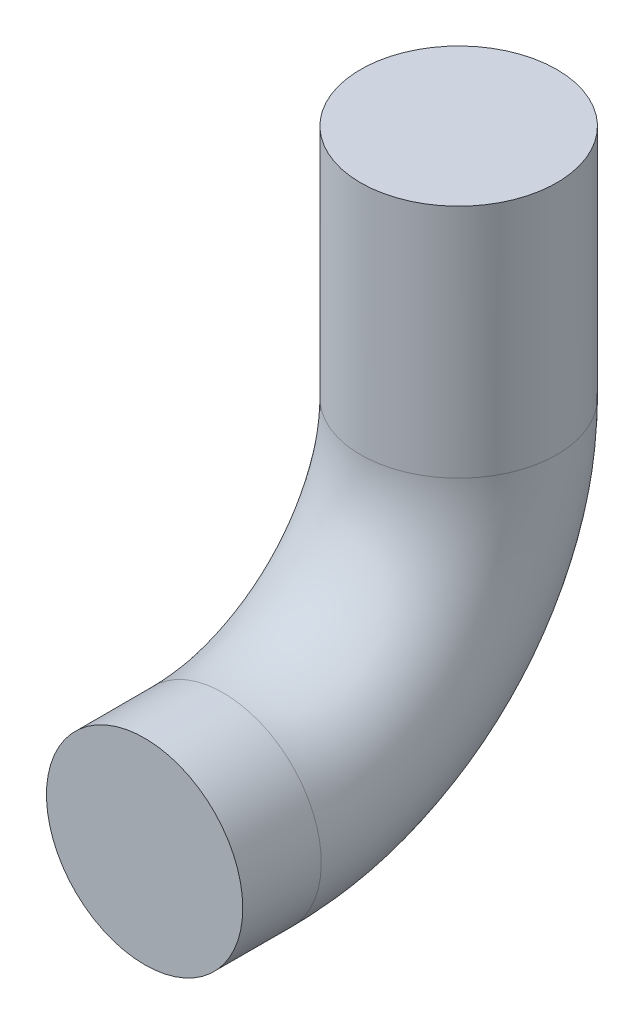
ISO-10303-21;
HEADER;
FILE_DESCRIPTION(('STEP AP214'),'2;1');
FILE_NAME('part.step','',(''),(''),'','','');
FILE_SCHEMA(('AUTOMOTIVE_DESIGN { 1 0 10303 214 1 1 1 1 }'));
ENDSEC;
DATA;
#1=APPLICATION_CONTEXT('core data for automotive mechanical design processes');
#2=APPLICATION_PROTOCOL_DEFINITION('international standard','automotive_design',2000,#1);
#3=PRODUCT_CONTEXT('',#1,'mechanical');
#4=PRODUCT('Part','Part','',(#3));
#5=PRODUCT_RELATED_PRODUCT_CATEGORY('part','',(#4));
#6=PRODUCT_DEFINITION_FORMATION('','',#4);
#7=PRODUCT_DEFINITION_CONTEXT('part definition',#1,'design');
#8=PRODUCT_DEFINITION('design','',#6,#7);
#9=PRODUCT_DEFINITION_SHAPE('','',#8);
#10=(LENGTH_UNIT() NAMED_UNIT(*) SI_UNIT(.MILLI.,.METRE.));
#11=(NAMED_UNIT(*) PLANE_ANGLE_UNIT() SI_UNIT($,.RADIAN.));
#12=(NAMED_UNIT(*) SI_UNIT($,.STERADIAN.) SOLID_ANGLE_UNIT());
#13=UNCERTAINTY_MEASURE_WITH_UNIT(LENGTH_MEASURE(1.E-05),#10,'distance_accuracy_value','');
#14=(GEOMETRIC_REPRESENTATION_CONTEXT(3) GLOBAL_UNCERTAINTY_ASSIGNED_CONTEXT((#13)) GLOBAL_UNIT_ASSIGNED_CONTEXT((#10,
#11,#12)) REPRESENTATION_CONTEXT('',''));
#15=CARTESIAN_POINT('',(0.,0.,0.));
#16=DIRECTION('',(0.,0.,1.));
#17=DIRECTION('',(1.,0.,0.));
#18=AXIS2_PLACEMENT_3D('',#15,#16,#17);
#19=CARTESIAN_POINT('',(0.,0.,0.));
#20=DIRECTION('',(-1.,0.,0.));
#21=DIRECTION('',(0.,0.,1.));
#22=AXIS2_PLACEMENT_3D('',#19,#20,#21);
#23=TOROIDAL_SURFACE('',#22,3.,1.25);
#24=CARTESIAN_POINT('',(0.,0.,-3.));
#25=DIRECTION('',(0.,1.,0.));
#26=DIRECTION('',(0.,0.,1.));
#27=AXIS2_PLACEMENT_3D('',#24,#25,#26);
#28=CIRCLE('',#27,1.25);
#29=CARTESIAN_POINT('',(0.,0.,-4.25));
#30=VERTEX_POINT('',#29);
#31=EDGE_CURVE('E46',#30,#30,#28,.T.);
#32=CARTESIAN_POINT('',(0.,-3.,0.));
#33=DIRECTION('',(0.,0.,1.));
#34=DIRECTION('',(1.,0.,0.));
#35=AXIS2_PLACEMENT_3D('',#32,#33,#34);
#36=CIRCLE('',#35,1.25);
#37=CARTESIAN_POINT('',(0.,-4.25,0.));
#38=VERTEX_POINT('',#37);
#39=EDGE_CURVE('E10',#38,#38,#36,.T.);
#40=CARTESIAN_POINT('',(0.,0.,0.));
#41=DIRECTION('',(-1.,0.,0.));
#42=DIRECTION('',(0.,0.,1.));
#43=AXIS2_PLACEMENT_3D('',#40,#41,#42);
#44=CIRCLE('',#43,4.25);
#45=EDGE_CURVE('',#30,#38,#44,.T.);
#46=ORIENTED_EDGE('',*,*,#31,.F.);
#47=ORIENTED_EDGE('',*,*,#39,.F.);
#48=ORIENTED_EDGE('',*,*,#45,.T.);
#49=ORIENTED_EDGE('',*,*,#45,.F.);
#50=EDGE_LOOP('',(#46,#48,#47,#49));
#51=FACE_BOUND('',#50,.T.);
#52=ADVANCED_FACE('F32',(#51),#23,.T.);
#53=CARTESIAN_POINT('',(0.,-3.,1.));
#54=DIRECTION('',(0.,0.,-1.));
#55=DIRECTION('',(-1.,0.,0.));
#56=AXIS2_PLACEMENT_3D('',#53,#54,#55);
#57=CYLINDRICAL_SURFACE('',#56,1.25);
#58=CARTESIAN_POINT('',(0.,-3.,1.));
#59=DIRECTION('',(0.,0.,1.));
#60=DIRECTION('',(1.,0.,0.));
#61=AXIS2_PLACEMENT_3D('',#58,#59,#60);
#62=CIRCLE('',#61,1.25);
#63=CARTESIAN_POINT('',(1.25,-3.,1.));
#64=VERTEX_POINT('',#63);
#65=EDGE_CURVE('E38',#64,#64,#62,.T.);
#66=ORIENTED_EDGE('',*,*,#65,.F.);
#67=EDGE_LOOP('',(#66));
#68=FACE_BOUND('',#67,.T.);
#69=ORIENTED_EDGE('',*,*,#39,.T.);
#70=EDGE_LOOP('',(#69));
#71=FACE_BOUND('',#70,.T.);
#72=ADVANCED_FACE('F56',(#68,#71),#57,.T.);
#73=CARTESIAN_POINT('',(0.,-3.,1.));
#74=DIRECTION('',(0.,0.,1.));
#75=DIRECTION('',(1.,0.,0.));
#76=AXIS2_PLACEMENT_3D('',#73,#74,#75);
#77=PLANE('',#76);
#78=ORIENTED_EDGE('',*,*,#65,.T.);
#79=EDGE_LOOP('',(#78));
#80=FACE_BOUND('',#79,.T.);
#81=ADVANCED_FACE('F60',(#80),#77,.T.);
#82=CARTESIAN_POINT('',(0.,3.00000000000001,-2.99999999999999));
#83=DIRECTION('',(0.,-1.,0.));
#84=DIRECTION('',(0.,0.,-1.));
#85=AXIS2_PLACEMENT_3D('',#82,#83,#84);
#86=CYLINDRICAL_SURFACE('',#85,1.25);
#87=CARTESIAN_POINT('',(0.,3.00000000000001,-2.99999999999999));
#88=DIRECTION('',(0.,1.,0.));
#89=DIRECTION('',(0.,0.,1.));
#90=AXIS2_PLACEMENT_3D('',#87,#88,#89);
#91=CIRCLE('',#90,1.25);
#92=CARTESIAN_POINT('',(0.,3.00000000000001,-1.74999999999999));
#93=VERTEX_POINT('',#92);
#94=EDGE_CURVE('E42',#93,#93,#91,.T.);
#95=ORIENTED_EDGE('',*,*,#94,.F.);
#96=EDGE_LOOP('',(#95));
#97=FACE_BOUND('',#96,.T.);
#98=ORIENTED_EDGE('',*,*,#31,.T.);
#99=EDGE_LOOP('',(#98));
#100=FACE_BOUND('',#99,.T.);
#101=ADVANCED_FACE('F52',(#97,#100),#86,.T.);
#102=CARTESIAN_POINT('',(0.,3.00000000000001,-2.99999999999999));
#103=DIRECTION('',(0.,1.,0.));
#104=DIRECTION('',(0.,0.,1.));
#105=AXIS2_PLACEMENT_3D('',#102,#103,#104);
#106=PLANE('',#105);
#107=ORIENTED_EDGE('',*,*,#94,.T.);
#108=EDGE_LOOP('',(#107));
#109=FACE_BOUND('',#108,.T.);
#110=ADVANCED_FACE('F69',(#109),#106,.T.);
#111=CLOSED_SHELL('',(#52,#72,#81,#101,#110));
#112=MANIFOLD_SOLID_BREP('B2',#111);
#113=ADVANCED_BREP_SHAPE_REPRESENTATION('',(#18,#112),#14);
#114=SHAPE_DEFINITION_REPRESENTATION(#9,#113);
ENDSEC;
END-ISO-10303-21;
